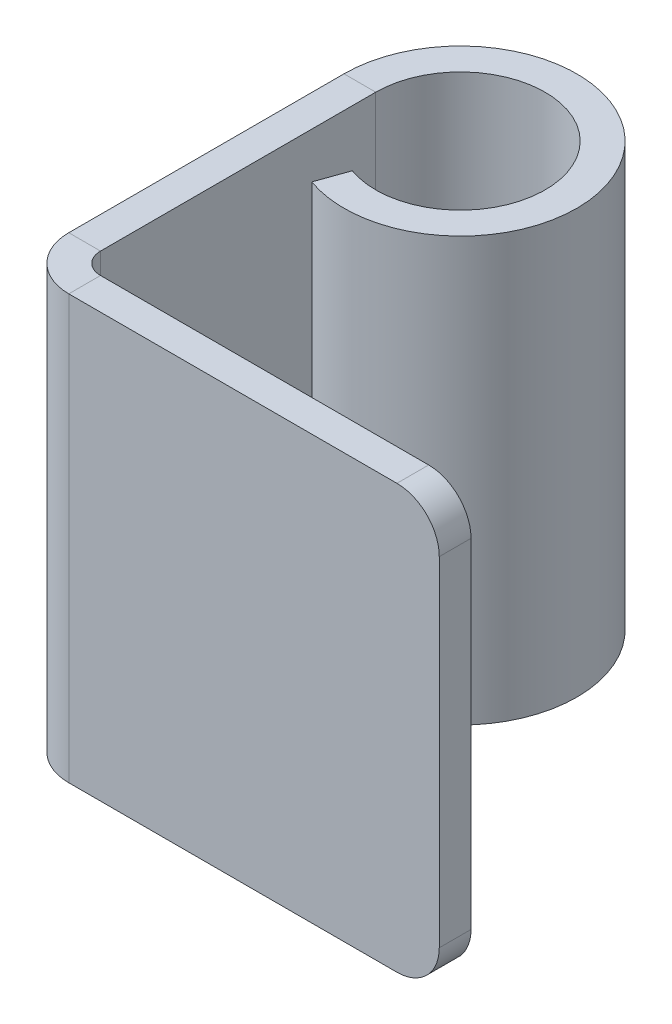
ISO-10303-21;
HEADER;
FILE_DESCRIPTION(('STEP AP214'),'2;1');
FILE_NAME('part.step','',(''),(''),'','','');
FILE_SCHEMA(('AUTOMOTIVE_DESIGN { 1 0 10303 214 1 1 1 1 }'));
ENDSEC;
DATA;
#1=APPLICATION_CONTEXT('core data for automotive mechanical design processes');
#2=APPLICATION_PROTOCOL_DEFINITION('international standard','automotive_design',2000,#1);
#3=PRODUCT_CONTEXT('',#1,'mechanical');
#4=PRODUCT('Part','Part','',(#3));
#5=PRODUCT_RELATED_PRODUCT_CATEGORY('part','',(#4));
#6=PRODUCT_DEFINITION_FORMATION('','',#4);
#7=PRODUCT_DEFINITION_CONTEXT('part definition',#1,'design');
#8=PRODUCT_DEFINITION('design','',#6,#7);
#9=PRODUCT_DEFINITION_SHAPE('','',#8);
#10=(LENGTH_UNIT() NAMED_UNIT(*) SI_UNIT(.MILLI.,.METRE.));
#11=(NAMED_UNIT(*) PLANE_ANGLE_UNIT() SI_UNIT($,.RADIAN.));
#12=(NAMED_UNIT(*) SI_UNIT($,.STERADIAN.) SOLID_ANGLE_UNIT());
#13=UNCERTAINTY_MEASURE_WITH_UNIT(LENGTH_MEASURE(1.E-05),#10,'distance_accuracy_value','');
#14=(GEOMETRIC_REPRESENTATION_CONTEXT(3) GLOBAL_UNCERTAINTY_ASSIGNED_CONTEXT((#13)) GLOBAL_UNIT_ASSIGNED_CONTEXT((#10,
#11,#12)) REPRESENTATION_CONTEXT('',''));
#15=CARTESIAN_POINT('',(0.,0.,0.));
#16=DIRECTION('',(0.,0.,1.));
#17=DIRECTION('',(1.,0.,0.));
#18=AXIS2_PLACEMENT_3D('',#15,#16,#17);
#19=CARTESIAN_POINT('',(42.2074417675063,10.,13.));
#20=DIRECTION('',(0.,-1.,0.));
#21=DIRECTION('',(1.,0.,0.));
#22=AXIS2_PLACEMENT_3D('',#19,#20,#21);
#23=PLANE('',#22);
#24=DIRECTION('',(0.,0.,-1.));
#25=VECTOR('',#24,1.);
#26=CARTESIAN_POINT('',(-5.5,10.,13.));
#27=LINE('',#26,#25);
#28=CARTESIAN_POINT('',(-5.5,10.,13.));
#29=VERTEX_POINT('',#28);
#30=CARTESIAN_POINT('',(-5.5,9.99999999999999,0.));
#31=VERTEX_POINT('',#30);
#32=EDGE_CURVE('E249',#29,#31,#27,.T.);
#33=ORIENTED_EDGE('',*,*,#32,.F.);
#34=DIRECTION('',(-1.,0.,0.));
#35=VECTOR('',#34,1.);
#36=CARTESIAN_POINT('',(42.2074417675063,10.,13.));
#37=LINE('',#36,#35);
#38=CARTESIAN_POINT('',(-4.,9.99999999999999,13.));
#39=VERTEX_POINT('',#38);
#40=EDGE_CURVE('E11',#39,#29,#37,.T.);
#41=ORIENTED_EDGE('',*,*,#40,.F.);
#42=DIRECTION('',(0.,0.,-1.));
#43=VECTOR('',#42,1.);
#44=CARTESIAN_POINT('',(-4.,10.,13.));
#45=LINE('',#44,#43);
#46=CARTESIAN_POINT('',(-4.,9.99999999999999,0.));
#47=VERTEX_POINT('',#46);
#48=EDGE_CURVE('E256',#47,#39,#45,.F.);
#49=ORIENTED_EDGE('',*,*,#48,.F.);
#50=DIRECTION('',(-1.,0.,0.));
#51=VECTOR('',#50,1.);
#52=CARTESIAN_POINT('',(42.2074417675063,10.,0.));
#53=LINE('',#52,#51);
#54=EDGE_CURVE('E272',#47,#31,#53,.T.);
#55=ORIENTED_EDGE('',*,*,#54,.T.);
#56=EDGE_LOOP('',(#33,#41,#49,#55));
#57=FACE_BOUND('',#56,.T.);
#58=ADVANCED_FACE('F41',(#57),#23,.F.);
#59=CARTESIAN_POINT('',(42.2074417675063,-9.99999999999999,13.));
#60=DIRECTION('',(0.,-1.,0.));
#61=DIRECTION('',(1.,0.,0.));
#62=AXIS2_PLACEMENT_3D('',#59,#60,#61);
#63=PLANE('',#62);
#64=DIRECTION('',(-1.,0.,0.));
#65=VECTOR('',#64,1.);
#66=CARTESIAN_POINT('',(42.2074417675063,-9.99999999999999,13.));
#67=LINE('',#66,#65);
#68=CARTESIAN_POINT('',(-4.,-10.,13.));
#69=VERTEX_POINT('',#68);
#70=CARTESIAN_POINT('',(-5.5,-10.,13.));
#71=VERTEX_POINT('',#70);
#72=EDGE_CURVE('E49',#69,#71,#67,.T.);
#73=ORIENTED_EDGE('',*,*,#72,.T.);
#74=DIRECTION('',(0.,0.,-1.));
#75=VECTOR('',#74,1.);
#76=CARTESIAN_POINT('',(-5.5,-10.,13.));
#77=LINE('',#76,#75);
#78=CARTESIAN_POINT('',(-5.49999999999999,-10.,0.));
#79=VERTEX_POINT('',#78);
#80=EDGE_CURVE('E184',#71,#79,#77,.T.);
#81=ORIENTED_EDGE('',*,*,#80,.T.);
#82=DIRECTION('',(-1.,0.,0.));
#83=VECTOR('',#82,1.);
#84=CARTESIAN_POINT('',(42.2074417675063,-9.99999999999999,0.));
#85=LINE('',#84,#83);
#86=CARTESIAN_POINT('',(-4.,-10.,0.));
#87=VERTEX_POINT('',#86);
#88=EDGE_CURVE('E148',#87,#79,#85,.T.);
#89=ORIENTED_EDGE('',*,*,#88,.F.);
#90=DIRECTION('',(0.,0.,-1.));
#91=VECTOR('',#90,1.);
#92=CARTESIAN_POINT('',(-4.,-10.,13.));
#93=LINE('',#92,#91);
#94=EDGE_CURVE('E264',#87,#69,#93,.F.);
#95=ORIENTED_EDGE('',*,*,#94,.T.);
#96=EDGE_LOOP('',(#73,#81,#89,#95));
#97=FACE_BOUND('',#96,.T.);
#98=ADVANCED_FACE('F281',(#97),#63,.T.);
#99=CARTESIAN_POINT('',(-4.,10.,0.));
#100=DIRECTION('',(-1.,0.,0.));
#101=DIRECTION('',(0.,0.,-1.));
#102=AXIS2_PLACEMENT_3D('',#99,#100,#101);
#103=PLANE('',#102);
#104=ORIENTED_EDGE('',*,*,#48,.T.);
#105=DIRECTION('',(0.,1.,0.));
#106=VECTOR('',#105,1.);
#107=CARTESIAN_POINT('',(-4.,10.,13.));
#108=LINE('',#107,#106);
#109=EDGE_CURVE('E260',#39,#69,#108,.F.);
#110=ORIENTED_EDGE('',*,*,#109,.T.);
#111=ORIENTED_EDGE('',*,*,#94,.F.);
#112=DIRECTION('',(0.,1.,0.));
#113=VECTOR('',#112,1.);
#114=CARTESIAN_POINT('',(-4.,10.,0.));
#115=LINE('',#114,#113);
#116=EDGE_CURVE('E268',#87,#47,#115,.T.);
#117=ORIENTED_EDGE('',*,*,#116,.T.);
#118=EDGE_LOOP('',(#104,#110,#111,#117));
#119=FACE_BOUND('',#118,.T.);
#120=ADVANCED_FACE('F299',(#119),#103,.F.);
#121=CARTESIAN_POINT('',(-5.5,10.,0.));
#122=DIRECTION('',(-1.,0.,0.));
#123=DIRECTION('',(0.,0.,-1.));
#124=AXIS2_PLACEMENT_3D('',#121,#122,#123);
#125=PLANE('',#124);
#126=ORIENTED_EDGE('',*,*,#80,.F.);
#127=DIRECTION('',(0.,-1.,0.));
#128=VECTOR('',#127,1.);
#129=CARTESIAN_POINT('',(-5.5,10.,13.));
#130=LINE('',#129,#128);
#131=EDGE_CURVE('E245',#71,#29,#130,.F.);
#132=ORIENTED_EDGE('',*,*,#131,.T.);
#133=ORIENTED_EDGE('',*,*,#32,.T.);
#134=DIRECTION('',(0.,-1.,0.));
#135=VECTOR('',#134,1.);
#136=CARTESIAN_POINT('',(-5.5,10.,0.));
#137=LINE('',#136,#135);
#138=EDGE_CURVE('E253',#31,#79,#137,.T.);
#139=ORIENTED_EDGE('',*,*,#138,.T.);
#140=EDGE_LOOP('',(#126,#132,#133,#139));
#141=FACE_BOUND('',#140,.T.);
#142=ADVANCED_FACE('F287',(#141),#125,.T.);
#143=CARTESIAN_POINT('',(14.5,10.,-37.6507290636733));
#144=DIRECTION('',(-1.,0.,0.));
#145=DIRECTION('',(0.,0.,1.));
#146=AXIS2_PLACEMENT_3D('',#143,#144,#145);
#147=PLANE('',#146);
#148=DIRECTION('',(0.,1.,0.));
#149=VECTOR('',#148,1.);
#150=CARTESIAN_POINT('',(14.5,10.,15.5));
#151=LINE('',#150,#149);
#152=CARTESIAN_POINT('',(14.5,8.,15.5));
#153=VERTEX_POINT('',#152);
#154=CARTESIAN_POINT('',(14.5,-8.,15.5));
#155=VERTEX_POINT('',#154);
#156=EDGE_CURVE('E234',#153,#155,#151,.F.);
#157=ORIENTED_EDGE('',*,*,#156,.T.);
#158=DIRECTION('',(0.,0.,1.));
#159=VECTOR('',#158,1.);
#160=CARTESIAN_POINT('',(14.5,-8.,-37.6507290636733));
#161=LINE('',#160,#159);
#162=CARTESIAN_POINT('',(14.5,-8.,14.));
#163=VERTEX_POINT('',#162);
#164=EDGE_CURVE('E216',#163,#155,#161,.T.);
#165=ORIENTED_EDGE('',*,*,#164,.F.);
#166=DIRECTION('',(0.,1.,0.));
#167=VECTOR('',#166,1.);
#168=CARTESIAN_POINT('',(14.5,10.,14.));
#169=LINE('',#168,#167);
#170=CARTESIAN_POINT('',(14.5,8.,14.));
#171=VERTEX_POINT('',#170);
#172=EDGE_CURVE('E195',#171,#163,#169,.F.);
#173=ORIENTED_EDGE('',*,*,#172,.F.);
#174=DIRECTION('',(0.,0.,1.));
#175=VECTOR('',#174,1.);
#176=CARTESIAN_POINT('',(14.5,8.,-37.6507290636733));
#177=LINE('',#176,#175);
#178=EDGE_CURVE('E230',#171,#153,#177,.T.);
#179=ORIENTED_EDGE('',*,*,#178,.T.);
#180=EDGE_LOOP('',(#157,#165,#173,#179));
#181=FACE_BOUND('',#180,.T.);
#182=ADVANCED_FACE('F328',(#181),#147,.F.);
#183=CARTESIAN_POINT('',(12.5,8.,-37.6507290636733));
#184=DIRECTION('',(0.,0.,1.));
#185=DIRECTION('',(1.,0.,0.));
#186=AXIS2_PLACEMENT_3D('',#183,#184,#185);
#187=CYLINDRICAL_SURFACE('',#186,2.);
#188=CARTESIAN_POINT('',(12.5,8.,15.5));
#189=DIRECTION('',(0.,0.,1.));
#190=DIRECTION('',(1.,0.,0.));
#191=AXIS2_PLACEMENT_3D('',#188,#189,#190);
#192=CIRCLE('',#191,2.);
#193=CARTESIAN_POINT('',(12.5,10.,15.5));
#194=VERTEX_POINT('',#193);
#195=EDGE_CURVE('E227',#194,#153,#192,.F.);
#196=ORIENTED_EDGE('',*,*,#195,.T.);
#197=ORIENTED_EDGE('',*,*,#178,.F.);
#198=CARTESIAN_POINT('',(12.5,8.,14.));
#199=DIRECTION('',(0.,0.,1.));
#200=DIRECTION('',(1.,0.,0.));
#201=AXIS2_PLACEMENT_3D('',#198,#199,#200);
#202=CIRCLE('',#201,2.);
#203=CARTESIAN_POINT('',(12.5,10.,14.));
#204=VERTEX_POINT('',#203);
#205=EDGE_CURVE('E198',#204,#171,#202,.F.);
#206=ORIENTED_EDGE('',*,*,#205,.F.);
#207=DIRECTION('',(0.,0.,1.));
#208=VECTOR('',#207,1.);
#209=CARTESIAN_POINT('',(12.5,10.,-37.6507290636733));
#210=LINE('',#209,#208);
#211=EDGE_CURVE('E223',#204,#194,#210,.T.);
#212=ORIENTED_EDGE('',*,*,#211,.T.);
#213=EDGE_LOOP('',(#196,#197,#206,#212));
#214=FACE_BOUND('',#213,.T.);
#215=ADVANCED_FACE('F318',(#214),#187,.T.);
#216=CARTESIAN_POINT('',(12.5,-8.,-37.6507290636733));
#217=DIRECTION('',(0.,0.,1.));
#218=DIRECTION('',(1.,0.,0.));
#219=AXIS2_PLACEMENT_3D('',#216,#217,#218);
#220=CYLINDRICAL_SURFACE('',#219,2.);
#221=CARTESIAN_POINT('',(12.5,-8.,15.5));
#222=DIRECTION('',(0.,0.,-1.));
#223=DIRECTION('',(-1.,0.,0.));
#224=AXIS2_PLACEMENT_3D('',#221,#222,#223);
#225=CIRCLE('',#224,2.);
#226=CARTESIAN_POINT('',(12.5,-10.,15.5));
#227=VERTEX_POINT('',#226);
#228=EDGE_CURVE('E220',#155,#227,#225,.T.);
#229=ORIENTED_EDGE('',*,*,#228,.T.);
#230=DIRECTION('',(0.,0.,1.));
#231=VECTOR('',#230,1.);
#232=CARTESIAN_POINT('',(12.5,-10.,-37.6507290636733));
#233=LINE('',#232,#231);
#234=CARTESIAN_POINT('',(12.5,-10.,14.));
#235=VERTEX_POINT('',#234);
#236=EDGE_CURVE('E212',#235,#227,#233,.T.);
#237=ORIENTED_EDGE('',*,*,#236,.F.);
#238=CARTESIAN_POINT('',(12.5,-8.,14.));
#239=DIRECTION('',(0.,0.,-1.));
#240=DIRECTION('',(-1.,0.,0.));
#241=AXIS2_PLACEMENT_3D('',#238,#239,#240);
#242=CIRCLE('',#241,2.);
#243=EDGE_CURVE('E192',#163,#235,#242,.T.);
#244=ORIENTED_EDGE('',*,*,#243,.F.);
#245=ORIENTED_EDGE('',*,*,#164,.T.);
#246=EDGE_LOOP('',(#229,#237,#244,#245));
#247=FACE_BOUND('',#246,.T.);
#248=ADVANCED_FACE('F332',(#247),#220,.T.);
#249=CARTESIAN_POINT('',(-3.,-10.,-37.6507290636733));
#250=DIRECTION('',(0.,-1.,0.));
#251=DIRECTION('',(0.,0.,-1.));
#252=AXIS2_PLACEMENT_3D('',#249,#250,#251);
#253=PLANE('',#252);
#254=ORIENTED_EDGE('',*,*,#236,.T.);
#255=DIRECTION('',(-1.,0.,0.));
#256=VECTOR('',#255,1.);
#257=CARTESIAN_POINT('',(-5.5,-10.,15.5));
#258=LINE('',#257,#256);
#259=CARTESIAN_POINT('',(-3.,-10.,15.5));
#260=VERTEX_POINT('',#259);
#261=EDGE_CURVE('E208',#227,#260,#258,.T.);
#262=ORIENTED_EDGE('',*,*,#261,.T.);
#263=DIRECTION('',(0.,0.,1.));
#264=VECTOR('',#263,1.);
#265=CARTESIAN_POINT('',(-3.,-10.,-37.6507290636733));
#266=LINE('',#265,#264);
#267=CARTESIAN_POINT('',(-3.,-10.,14.));
#268=VERTEX_POINT('',#267);
#269=EDGE_CURVE('E174',#268,#260,#266,.T.);
#270=ORIENTED_EDGE('',*,*,#269,.F.);
#271=DIRECTION('',(1.,0.,0.));
#272=VECTOR('',#271,1.);
#273=CARTESIAN_POINT('',(-3.,-10.,14.));
#274=LINE('',#273,#272);
#275=EDGE_CURVE('E204',#268,#235,#274,.T.);
#276=ORIENTED_EDGE('',*,*,#275,.T.);
#277=EDGE_LOOP('',(#254,#262,#270,#276));
#278=FACE_BOUND('',#277,.T.);
#279=ADVANCED_FACE('F335',(#278),#253,.T.);
#280=CARTESIAN_POINT('',(-5.5,10.,14.));
#281=DIRECTION('',(0.,0.,1.));
#282=DIRECTION('',(-1.,0.,0.));
#283=AXIS2_PLACEMENT_3D('',#280,#281,#282);
#284=PLANE('',#283);
#285=DIRECTION('',(1.,0.,0.));
#286=VECTOR('',#285,1.);
#287=CARTESIAN_POINT('',(-4.,10.,14.));
#288=LINE('',#287,#286);
#289=CARTESIAN_POINT('',(-3.,10.,14.));
#290=VERTEX_POINT('',#289);
#291=EDGE_CURVE('E201',#290,#204,#288,.T.);
#292=ORIENTED_EDGE('',*,*,#291,.T.);
#293=ORIENTED_EDGE('',*,*,#205,.T.);
#294=ORIENTED_EDGE('',*,*,#172,.T.);
#295=ORIENTED_EDGE('',*,*,#243,.T.);
#296=ORIENTED_EDGE('',*,*,#275,.F.);
#297=DIRECTION('',(0.,1.,0.));
#298=VECTOR('',#297,1.);
#299=CARTESIAN_POINT('',(-3.,10.,14.));
#300=LINE('',#299,#298);
#301=EDGE_CURVE('E188',#268,#290,#300,.T.);
#302=ORIENTED_EDGE('',*,*,#301,.T.);
#303=EDGE_LOOP('',(#292,#293,#294,#295,#296,#302));
#304=FACE_BOUND('',#303,.T.);
#305=ADVANCED_FACE('F311',(#304),#284,.F.);
#306=CARTESIAN_POINT('',(-4.,10.,-37.6507290636733));
#307=DIRECTION('',(0.,-1.,0.));
#308=DIRECTION('',(0.,0.,-1.));
#309=AXIS2_PLACEMENT_3D('',#306,#307,#308);
#310=PLANE('',#309);
#311=DIRECTION('',(-1.,0.,0.));
#312=VECTOR('',#311,1.);
#313=CARTESIAN_POINT('',(-5.5,10.,15.5));
#314=LINE('',#313,#312);
#315=CARTESIAN_POINT('',(-3.,10.,15.5));
#316=VERTEX_POINT('',#315);
#317=EDGE_CURVE('E185',#316,#194,#314,.F.);
#318=ORIENTED_EDGE('',*,*,#317,.T.);
#319=ORIENTED_EDGE('',*,*,#211,.F.);
#320=ORIENTED_EDGE('',*,*,#291,.F.);
#321=DIRECTION('',(0.,0.,1.));
#322=VECTOR('',#321,1.);
#323=CARTESIAN_POINT('',(-3.,10.,-37.6507290636733));
#324=LINE('',#323,#322);
#325=EDGE_CURVE('E180',#290,#316,#324,.T.);
#326=ORIENTED_EDGE('',*,*,#325,.T.);
#327=EDGE_LOOP('',(#318,#319,#320,#326));
#328=FACE_BOUND('',#327,.T.);
#329=ADVANCED_FACE('F315',(#328),#310,.F.);
#330=CARTESIAN_POINT('',(-5.5,10.,15.5));
#331=DIRECTION('',(0.,0.,1.));
#332=DIRECTION('',(-1.,0.,0.));
#333=AXIS2_PLACEMENT_3D('',#330,#331,#332);
#334=PLANE('',#333);
#335=ORIENTED_EDGE('',*,*,#156,.F.);
#336=ORIENTED_EDGE('',*,*,#195,.F.);
#337=ORIENTED_EDGE('',*,*,#317,.F.);
#338=DIRECTION('',(0.,1.,0.));
#339=VECTOR('',#338,1.);
#340=CARTESIAN_POINT('',(-3.,10.,15.5));
#341=LINE('',#340,#339);
#342=EDGE_CURVE('E237',#260,#316,#341,.T.);
#343=ORIENTED_EDGE('',*,*,#342,.F.);
#344=ORIENTED_EDGE('',*,*,#261,.F.);
#345=ORIENTED_EDGE('',*,*,#228,.F.);
#346=EDGE_LOOP('',(#335,#336,#337,#343,#344,#345));
#347=FACE_BOUND('',#346,.T.);
#348=ADVANCED_FACE('F322',(#347),#334,.T.);
#349=CARTESIAN_POINT('',(-3.,10.,13.));
#350=DIRECTION('',(0.,1.,0.));
#351=DIRECTION('',(-1.,0.,0.));
#352=AXIS2_PLACEMENT_3D('',#349,#350,#351);
#353=PLANE('',#352);
#354=ORIENTED_EDGE('',*,*,#325,.F.);
#355=CARTESIAN_POINT('',(-3.,10.,13.));
#356=DIRECTION('',(0.,1.,0.));
#357=DIRECTION('',(0.,0.,1.));
#358=AXIS2_PLACEMENT_3D('',#355,#356,#357);
#359=CIRCLE('',#358,1.);
#360=EDGE_CURVE('E171',#290,#39,#359,.F.);
#361=ORIENTED_EDGE('',*,*,#360,.T.);
#362=ORIENTED_EDGE('',*,*,#40,.T.);
#363=CARTESIAN_POINT('',(-3.,10.,13.));
#364=DIRECTION('',(0.,1.,0.));
#365=DIRECTION('',(0.,0.,1.));
#366=AXIS2_PLACEMENT_3D('',#363,#364,#365);
#367=CIRCLE('',#366,2.5);
#368=EDGE_CURVE('E56',#316,#29,#367,.F.);
#369=ORIENTED_EDGE('',*,*,#368,.F.);
#370=EDGE_LOOP('',(#354,#361,#362,#369));
#371=FACE_BOUND('',#370,.T.);
#372=ADVANCED_FACE('F305',(#371),#353,.T.);
#373=CARTESIAN_POINT('',(-3.,-10.,13.));
#374=DIRECTION('',(0.,-1.,0.));
#375=DIRECTION('',(0.,0.,-1.));
#376=AXIS2_PLACEMENT_3D('',#373,#374,#375);
#377=PLANE('',#376);
#378=ORIENTED_EDGE('',*,*,#72,.F.);
#379=CARTESIAN_POINT('',(-3.,-10.,13.));
#380=DIRECTION('',(0.,1.,0.));
#381=DIRECTION('',(0.,0.,1.));
#382=AXIS2_PLACEMENT_3D('',#379,#380,#381);
#383=CIRCLE('',#382,1.);
#384=EDGE_CURVE('E166',#69,#268,#383,.T.);
#385=ORIENTED_EDGE('',*,*,#384,.T.);
#386=ORIENTED_EDGE('',*,*,#269,.T.);
#387=CARTESIAN_POINT('',(-3.,-10.,13.));
#388=DIRECTION('',(0.,1.,0.));
#389=DIRECTION('',(0.,0.,1.));
#390=AXIS2_PLACEMENT_3D('',#387,#388,#389);
#391=CIRCLE('',#390,2.5);
#392=EDGE_CURVE('E167',#71,#260,#391,.T.);
#393=ORIENTED_EDGE('',*,*,#392,.F.);
#394=EDGE_LOOP('',(#378,#385,#386,#393));
#395=FACE_BOUND('',#394,.T.);
#396=ADVANCED_FACE('F336',(#395),#377,.T.);
#397=CARTESIAN_POINT('',(-2.99999999999999,-69.0009427679598,13.));
#398=DIRECTION('',(0.,1.,0.));
#399=DIRECTION('',(0.,0.,1.));
#400=AXIS2_PLACEMENT_3D('',#397,#398,#399);
#401=CYLINDRICAL_SURFACE('',#400,2.5);
#402=ORIENTED_EDGE('',*,*,#392,.T.);
#403=ORIENTED_EDGE('',*,*,#342,.T.);
#404=ORIENTED_EDGE('',*,*,#368,.T.);
#405=ORIENTED_EDGE('',*,*,#131,.F.);
#406=EDGE_LOOP('',(#402,#403,#404,#405));
#407=FACE_BOUND('',#406,.T.);
#408=ADVANCED_FACE('F337',(#407),#401,.T.);
#409=CARTESIAN_POINT('',(-2.99999999999999,-69.0009427679598,13.));
#410=DIRECTION('',(0.,1.,0.));
#411=DIRECTION('',(0.,0.,1.));
#412=AXIS2_PLACEMENT_3D('',#409,#410,#411);
#413=CYLINDRICAL_SURFACE('',#412,1.);
#414=ORIENTED_EDGE('',*,*,#384,.F.);
#415=ORIENTED_EDGE('',*,*,#109,.F.);
#416=ORIENTED_EDGE('',*,*,#360,.F.);
#417=ORIENTED_EDGE('',*,*,#301,.F.);
#418=EDGE_LOOP('',(#414,#415,#416,#417));
#419=FACE_BOUND('',#418,.T.);
#420=ADVANCED_FACE('F301',(#419),#413,.F.);
#421=CARTESIAN_POINT('',(0.,9.99999999999999,0.));
#422=DIRECTION('',(0.,1.,0.));
#423=DIRECTION('',(-1.,0.,0.));
#424=AXIS2_PLACEMENT_3D('',#421,#422,#423);
#425=PLANE('',#424);
#426=ORIENTED_EDGE('',*,*,#54,.F.);
#427=CARTESIAN_POINT('',(0.,9.99999999999999,0.));
#428=DIRECTION('',(0.,1.,0.));
#429=DIRECTION('',(-1.,0.,0.));
#430=AXIS2_PLACEMENT_3D('',#427,#428,#429);
#431=CIRCLE('',#430,4.);
#432=CARTESIAN_POINT('',(-1.33763938068314,9.99999999999999,3.76971098192496));
#433=VERTEX_POINT('',#432);
#434=EDGE_CURVE('E151',#47,#433,#431,.F.);
#435=ORIENTED_EDGE('',*,*,#434,.T.);
#436=DIRECTION('',(-0.334409845170784,0.,0.94242774548124));
#437=VECTOR('',#436,1.);
#438=CARTESIAN_POINT('',(-1.48812381100999,10.,4.19380346739152));
#439=LINE('',#438,#437);
#440=CARTESIAN_POINT('',(-1.83925414843931,9.99999999999999,5.18335260014682));
#441=VERTEX_POINT('',#440);
#442=EDGE_CURVE('E139',#433,#441,#439,.T.);
#443=ORIENTED_EDGE('',*,*,#442,.T.);
#444=CARTESIAN_POINT('',(0.,9.99999999999999,0.));
#445=DIRECTION('',(0.,1.,0.));
#446=DIRECTION('',(-1.,0.,0.));
#447=AXIS2_PLACEMENT_3D('',#444,#445,#446);
#448=CIRCLE('',#447,5.5);
#449=EDGE_CURVE('E140',#31,#441,#448,.F.);
#450=ORIENTED_EDGE('',*,*,#449,.F.);
#451=EDGE_LOOP('',(#426,#435,#443,#450));
#452=FACE_BOUND('',#451,.T.);
#453=ADVANCED_FACE('F294',(#452),#425,.T.);
#454=CARTESIAN_POINT('',(-1.48812381100998,0.,4.19380346739152));
#455=DIRECTION('',(-0.94242774548124,0.,-0.334409845170783));
#456=DIRECTION('',(0.,-1.,0.));
#457=AXIS2_PLACEMENT_3D('',#454,#455,#456);
#458=PLANE('',#457);
#459=ORIENTED_EDGE('',*,*,#442,.F.);
#460=DIRECTION('',(0.,1.,0.));
#461=VECTOR('',#460,1.);
#462=CARTESIAN_POINT('',(-1.33763938068312,-57.3608402776607,3.76971098192495));
#463=LINE('',#462,#461);
#464=CARTESIAN_POINT('',(-1.33763938068313,-10.,3.76971098192496));
#465=VERTEX_POINT('',#464);
#466=EDGE_CURVE('E135',#433,#465,#463,.F.);
#467=ORIENTED_EDGE('',*,*,#466,.T.);
#468=DIRECTION('',(-0.334409845170782,0.,0.94242774548124));
#469=VECTOR('',#468,1.);
#470=CARTESIAN_POINT('',(-1.48812381100998,-10.,4.19380346739152));
#471=LINE('',#470,#469);
#472=CARTESIAN_POINT('',(-1.8392541484393,-10.,5.18335260014682));
#473=VERTEX_POINT('',#472);
#474=EDGE_CURVE('E131',#465,#473,#471,.T.);
#475=ORIENTED_EDGE('',*,*,#474,.T.);
#476=DIRECTION('',(0.,1.,0.));
#477=VECTOR('',#476,1.);
#478=CARTESIAN_POINT('',(-1.83925414843929,-57.3608402776607,5.18335260014681));
#479=LINE('',#478,#477);
#480=EDGE_CURVE('E133',#441,#473,#479,.F.);
#481=ORIENTED_EDGE('',*,*,#480,.F.);
#482=EDGE_LOOP('',(#459,#467,#475,#481));
#483=FACE_BOUND('',#482,.T.);
#484=ADVANCED_FACE('F132',(#483),#458,.T.);
#485=CARTESIAN_POINT('',(0.,-10.,0.));
#486=DIRECTION('',(0.,-1.,0.));
#487=DIRECTION('',(1.,0.,0.));
#488=AXIS2_PLACEMENT_3D('',#485,#486,#487);
#489=PLANE('',#488);
#490=ORIENTED_EDGE('',*,*,#474,.F.);
#491=CARTESIAN_POINT('',(0.,-10.,0.));
#492=DIRECTION('',(0.,1.,0.));
#493=DIRECTION('',(-1.,0.,0.));
#494=AXIS2_PLACEMENT_3D('',#491,#492,#493);
#495=CIRCLE('',#494,4.);
#496=EDGE_CURVE('E159',#465,#87,#495,.T.);
#497=ORIENTED_EDGE('',*,*,#496,.T.);
#498=ORIENTED_EDGE('',*,*,#88,.T.);
#499=CARTESIAN_POINT('',(0.,-10.,0.));
#500=DIRECTION('',(0.,1.,0.));
#501=DIRECTION('',(-1.,0.,0.));
#502=AXIS2_PLACEMENT_3D('',#499,#500,#501);
#503=CIRCLE('',#502,5.5);
#504=EDGE_CURVE('E63',#473,#79,#503,.T.);
#505=ORIENTED_EDGE('',*,*,#504,.F.);
#506=EDGE_LOOP('',(#490,#497,#498,#505));
#507=FACE_BOUND('',#506,.T.);
#508=ADVANCED_FACE('F146',(#507),#489,.T.);
#509=CARTESIAN_POINT('',(0.,-57.3608402776607,0.));
#510=DIRECTION('',(0.,1.,0.));
#511=DIRECTION('',(-1.,0.,0.));
#512=AXIS2_PLACEMENT_3D('',#509,#510,#511);
#513=CYLINDRICAL_SURFACE('',#512,5.5);
#514=ORIENTED_EDGE('',*,*,#504,.T.);
#515=ORIENTED_EDGE('',*,*,#138,.F.);
#516=ORIENTED_EDGE('',*,*,#449,.T.);
#517=ORIENTED_EDGE('',*,*,#480,.T.);
#518=EDGE_LOOP('',(#514,#515,#516,#517));
#519=FACE_BOUND('',#518,.T.);
#520=ADVANCED_FACE('F143',(#519),#513,.T.);
#521=CARTESIAN_POINT('',(0.,-57.3608402776607,0.));
#522=DIRECTION('',(0.,1.,0.));
#523=DIRECTION('',(-1.,0.,0.));
#524=AXIS2_PLACEMENT_3D('',#521,#522,#523);
#525=CYLINDRICAL_SURFACE('',#524,4.);
#526=ORIENTED_EDGE('',*,*,#496,.F.);
#527=ORIENTED_EDGE('',*,*,#466,.F.);
#528=ORIENTED_EDGE('',*,*,#434,.F.);
#529=ORIENTED_EDGE('',*,*,#116,.F.);
#530=EDGE_LOOP('',(#526,#527,#528,#529));
#531=FACE_BOUND('',#530,.T.);
#532=ADVANCED_FACE('F297',(#531),#525,.F.);
#533=CLOSED_SHELL('',(#58,#98,#120,#142,#182,#215,#248,#279,#305,#329,#348,#372,#396,#408,#420,
#453,#484,#508,#520,#532));
#534=MANIFOLD_SOLID_BREP('B2',#533);
#535=ADVANCED_BREP_SHAPE_REPRESENTATION('',(#18,#534),#14);
#536=SHAPE_DEFINITION_REPRESENTATION(#9,#535);
ENDSEC;
END-ISO-10303-21;
